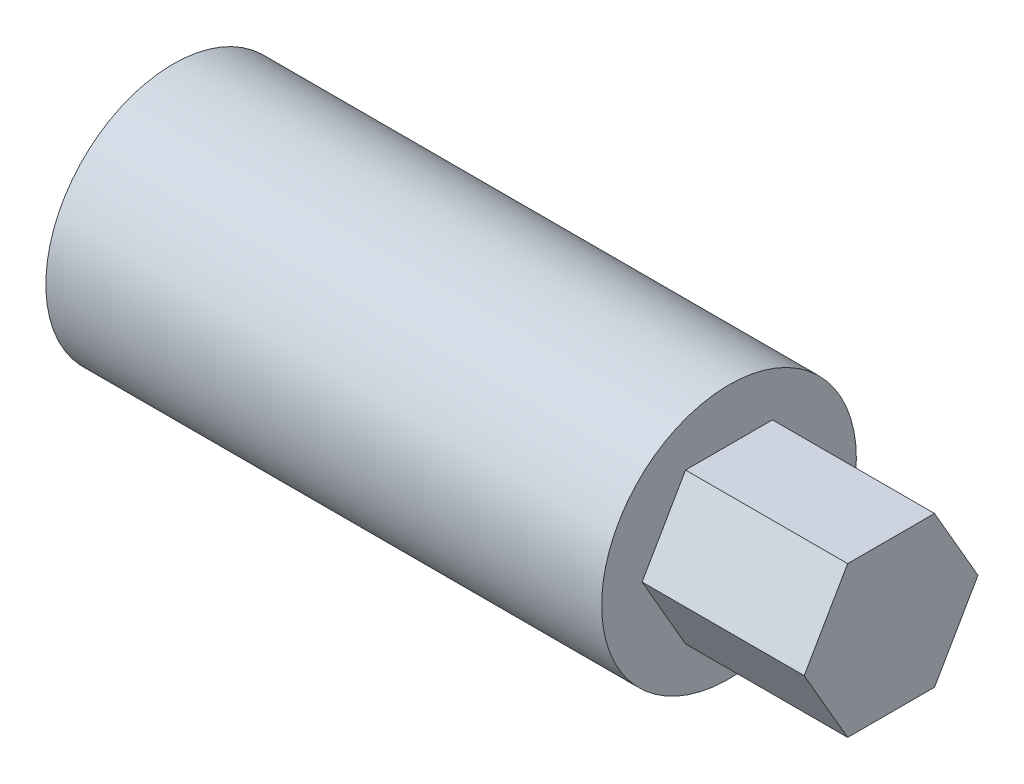
ISO-10303-21;
HEADER;
FILE_DESCRIPTION(('STEP AP214'),'2;1');
FILE_NAME('part.step','',(''),(''),'','','');
FILE_SCHEMA(('AUTOMOTIVE_DESIGN { 1 0 10303 214 1 1 1 1 }'));
ENDSEC;
DATA;
#1=APPLICATION_CONTEXT('core data for automotive mechanical design processes');
#2=APPLICATION_PROTOCOL_DEFINITION('international standard','automotive_design',2000,#1);
#3=PRODUCT_CONTEXT('',#1,'mechanical');
#4=PRODUCT('Part','Part','',(#3));
#5=PRODUCT_RELATED_PRODUCT_CATEGORY('part','',(#4));
#6=PRODUCT_DEFINITION_FORMATION('','',#4);
#7=PRODUCT_DEFINITION_CONTEXT('part definition',#1,'design');
#8=PRODUCT_DEFINITION('design','',#6,#7);
#9=PRODUCT_DEFINITION_SHAPE('','',#8);
#10=(LENGTH_UNIT() NAMED_UNIT(*) SI_UNIT(.MILLI.,.METRE.));
#11=(NAMED_UNIT(*) PLANE_ANGLE_UNIT() SI_UNIT($,.RADIAN.));
#12=(NAMED_UNIT(*) SI_UNIT($,.STERADIAN.) SOLID_ANGLE_UNIT());
#13=UNCERTAINTY_MEASURE_WITH_UNIT(LENGTH_MEASURE(1.E-05),#10,'distance_accuracy_value','');
#14=(GEOMETRIC_REPRESENTATION_CONTEXT(3) GLOBAL_UNCERTAINTY_ASSIGNED_CONTEXT((#13)) GLOBAL_UNIT_ASSIGNED_CONTEXT((#10,
#11,#12)) REPRESENTATION_CONTEXT('',''));
#15=CARTESIAN_POINT('',(0.,0.,0.));
#16=DIRECTION('',(0.,0.,1.));
#17=DIRECTION('',(1.,0.,0.));
#18=AXIS2_PLACEMENT_3D('',#15,#16,#17);
#19=CARTESIAN_POINT('',(62.,0.,0.));
#20=DIRECTION('',(-1.,0.,0.));
#21=DIRECTION('',(0.,0.,1.));
#22=AXIS2_PLACEMENT_3D('',#19,#20,#21);
#23=CYLINDRICAL_SURFACE('',#22,11.);
#24=CARTESIAN_POINT('',(0.,0.,0.));
#25=DIRECTION('',(1.,0.,0.));
#26=DIRECTION('',(0.,0.,-1.));
#27=AXIS2_PLACEMENT_3D('',#24,#25,#26);
#28=CIRCLE('',#27,11.);
#29=CARTESIAN_POINT('',(0.,0.,-11.));
#30=VERTEX_POINT('',#29);
#31=EDGE_CURVE('E11',#30,#30,#28,.T.);
#32=ORIENTED_EDGE('',*,*,#31,.T.);
#33=EDGE_LOOP('',(#32));
#34=FACE_BOUND('',#33,.T.);
#35=CARTESIAN_POINT('',(48.,0.,0.));
#36=DIRECTION('',(1.,0.,0.));
#37=DIRECTION('',(0.,0.,-1.));
#38=AXIS2_PLACEMENT_3D('',#35,#36,#37);
#39=CIRCLE('',#38,11.);
#40=CARTESIAN_POINT('',(48.,0.,-11.));
#41=VERTEX_POINT('',#40);
#42=EDGE_CURVE('E52',#41,#41,#39,.T.);
#43=ORIENTED_EDGE('',*,*,#42,.F.);
#44=EDGE_LOOP('',(#43));
#45=FACE_BOUND('',#44,.T.);
#46=ADVANCED_FACE('F44',(#34,#45),#23,.T.);
#47=CARTESIAN_POINT('',(0.,0.,0.));
#48=DIRECTION('',(1.,0.,0.));
#49=DIRECTION('',(0.,0.,-1.));
#50=AXIS2_PLACEMENT_3D('',#47,#48,#49);
#51=PLANE('',#50);
#52=ORIENTED_EDGE('',*,*,#31,.F.);
#53=EDGE_LOOP('',(#52));
#54=FACE_BOUND('',#53,.T.);
#55=ADVANCED_FACE('F171',(#54),#51,.F.);
#56=CARTESIAN_POINT('',(48.,0.,0.));
#57=DIRECTION('',(1.,0.,0.));
#58=DIRECTION('',(0.,0.,-1.));
#59=AXIS2_PLACEMENT_3D('',#56,#57,#58);
#60=PLANE('',#59);
#61=DIRECTION('',(0.,0.,1.));
#62=VECTOR('',#61,1.);
#63=CARTESIAN_POINT('',(48.,6.5,-3.75277674973257));
#64=LINE('',#63,#62);
#65=CARTESIAN_POINT('',(48.,6.5,-3.75277674973257));
#66=VERTEX_POINT('',#65);
#67=CARTESIAN_POINT('',(48.,6.5,3.75277674973257));
#68=VERTEX_POINT('',#67);
#69=EDGE_CURVE('E112',#66,#68,#64,.T.);
#70=ORIENTED_EDGE('',*,*,#69,.F.);
#71=DIRECTION('',(0.,0.866025403784439,0.5));
#72=VECTOR('',#71,1.);
#73=CARTESIAN_POINT('',(48.,0.,-7.50555349946514));
#74=LINE('',#73,#72);
#75=CARTESIAN_POINT('',(48.,0.,-7.50555349946514));
#76=VERTEX_POINT('',#75);
#77=EDGE_CURVE('E140',#76,#66,#74,.T.);
#78=ORIENTED_EDGE('',*,*,#77,.F.);
#79=DIRECTION('',(0.,0.866025403784438,-0.5));
#80=VECTOR('',#79,1.);
#81=CARTESIAN_POINT('',(48.,-6.5,-3.75277674973257));
#82=LINE('',#81,#80);
#83=CARTESIAN_POINT('',(48.,-6.5,-3.75277674973257));
#84=VERTEX_POINT('',#83);
#85=EDGE_CURVE('E134',#84,#76,#82,.T.);
#86=ORIENTED_EDGE('',*,*,#85,.F.);
#87=DIRECTION('',(0.,0.,-1.));
#88=VECTOR('',#87,1.);
#89=CARTESIAN_POINT('',(48.,-6.5,3.75277674973257));
#90=LINE('',#89,#88);
#91=CARTESIAN_POINT('',(48.,-6.5,3.75277674973257));
#92=VERTEX_POINT('',#91);
#93=EDGE_CURVE('E66',#92,#84,#90,.T.);
#94=ORIENTED_EDGE('',*,*,#93,.F.);
#95=DIRECTION('',(0.,-0.866025403784438,-0.5));
#96=VECTOR('',#95,1.);
#97=CARTESIAN_POINT('',(48.,0.,7.50555349946514));
#98=LINE('',#97,#96);
#99=CARTESIAN_POINT('',(48.,0.,7.50555349946514));
#100=VERTEX_POINT('',#99);
#101=EDGE_CURVE('E105',#100,#92,#98,.T.);
#102=ORIENTED_EDGE('',*,*,#101,.F.);
#103=DIRECTION('',(0.,-0.866025403784438,0.5));
#104=VECTOR('',#103,1.);
#105=CARTESIAN_POINT('',(48.,6.5,3.75277674973257));
#106=LINE('',#105,#104);
#107=EDGE_CURVE('E120',#68,#100,#106,.T.);
#108=ORIENTED_EDGE('',*,*,#107,.F.);
#109=EDGE_LOOP('',(#70,#78,#86,#94,#102,#108));
#110=FACE_BOUND('',#109,.T.);
#111=ORIENTED_EDGE('',*,*,#42,.T.);
#112=EDGE_LOOP('',(#111));
#113=FACE_BOUND('',#112,.T.);
#114=ADVANCED_FACE('F113',(#110,#113),#60,.T.);
#115=CARTESIAN_POINT('',(48.,6.5,3.75277674973257));
#116=DIRECTION('',(0.,0.5,0.866025403784438));
#117=DIRECTION('',(0.,-0.866025403784439,0.5));
#118=AXIS2_PLACEMENT_3D('',#115,#116,#117);
#119=PLANE('',#118);
#120=DIRECTION('',(0.,-0.866025403784438,0.5));
#121=VECTOR('',#120,1.);
#122=CARTESIAN_POINT('',(62.,6.5,3.75277674973257));
#123=LINE('',#122,#121);
#124=CARTESIAN_POINT('',(62.,6.5,3.75277674973257));
#125=VERTEX_POINT('',#124);
#126=CARTESIAN_POINT('',(62.,0.,7.50555349946514));
#127=VERTEX_POINT('',#126);
#128=EDGE_CURVE('E141',#125,#127,#123,.T.);
#129=ORIENTED_EDGE('',*,*,#128,.F.);
#130=DIRECTION('',(1.,0.,0.));
#131=VECTOR('',#130,1.);
#132=CARTESIAN_POINT('',(48.,6.5,3.75277674973257));
#133=LINE('',#132,#131);
#134=EDGE_CURVE('E125',#68,#125,#133,.T.);
#135=ORIENTED_EDGE('',*,*,#134,.F.);
#136=ORIENTED_EDGE('',*,*,#107,.T.);
#137=DIRECTION('',(1.,0.,0.));
#138=VECTOR('',#137,1.);
#139=CARTESIAN_POINT('',(48.,0.,7.50555349946514));
#140=LINE('',#139,#138);
#141=EDGE_CURVE('E99',#100,#127,#140,.T.);
#142=ORIENTED_EDGE('',*,*,#141,.T.);
#143=EDGE_LOOP('',(#129,#135,#136,#142));
#144=FACE_BOUND('',#143,.T.);
#145=ADVANCED_FACE('F123',(#144),#119,.T.);
#146=CARTESIAN_POINT('',(48.,6.5,-3.75277674973257));
#147=DIRECTION('',(0.,1.,0.));
#148=DIRECTION('',(0.,0.,1.));
#149=AXIS2_PLACEMENT_3D('',#146,#147,#148);
#150=PLANE('',#149);
#151=DIRECTION('',(0.,0.,1.));
#152=VECTOR('',#151,1.);
#153=CARTESIAN_POINT('',(62.,6.5,-3.75277674973257));
#154=LINE('',#153,#152);
#155=CARTESIAN_POINT('',(62.,6.5,-3.75277674973257));
#156=VERTEX_POINT('',#155);
#157=EDGE_CURVE('E122',#156,#125,#154,.T.);
#158=ORIENTED_EDGE('',*,*,#157,.F.);
#159=DIRECTION('',(1.,0.,0.));
#160=VECTOR('',#159,1.);
#161=CARTESIAN_POINT('',(48.,6.5,-3.75277674973257));
#162=LINE('',#161,#160);
#163=EDGE_CURVE('E157',#66,#156,#162,.T.);
#164=ORIENTED_EDGE('',*,*,#163,.F.);
#165=ORIENTED_EDGE('',*,*,#69,.T.);
#166=ORIENTED_EDGE('',*,*,#134,.T.);
#167=EDGE_LOOP('',(#158,#164,#165,#166));
#168=FACE_BOUND('',#167,.T.);
#169=ADVANCED_FACE('F195',(#168),#150,.T.);
#170=CARTESIAN_POINT('',(48.,0.,-7.50555349946514));
#171=DIRECTION('',(0.,0.5,-0.866025403784439));
#172=DIRECTION('',(0.,0.866025403784439,0.5));
#173=AXIS2_PLACEMENT_3D('',#170,#171,#172);
#174=PLANE('',#173);
#175=DIRECTION('',(0.,0.866025403784439,0.5));
#176=VECTOR('',#175,1.);
#177=CARTESIAN_POINT('',(62.,0.,-7.50555349946514));
#178=LINE('',#177,#176);
#179=CARTESIAN_POINT('',(62.,0.,-7.50555349946514));
#180=VERTEX_POINT('',#179);
#181=EDGE_CURVE('E126',#180,#156,#178,.T.);
#182=ORIENTED_EDGE('',*,*,#181,.F.);
#183=DIRECTION('',(1.,0.,0.));
#184=VECTOR('',#183,1.);
#185=CARTESIAN_POINT('',(48.,0.,-7.50555349946514));
#186=LINE('',#185,#184);
#187=EDGE_CURVE('E165',#76,#180,#186,.T.);
#188=ORIENTED_EDGE('',*,*,#187,.F.);
#189=ORIENTED_EDGE('',*,*,#77,.T.);
#190=ORIENTED_EDGE('',*,*,#163,.T.);
#191=EDGE_LOOP('',(#182,#188,#189,#190));
#192=FACE_BOUND('',#191,.T.);
#193=ADVANCED_FACE('F203',(#192),#174,.T.);
#194=CARTESIAN_POINT('',(48.,-6.5,-3.75277674973257));
#195=DIRECTION('',(0.,-0.5,-0.866025403784438));
#196=DIRECTION('',(0.,0.866025403784439,-0.5));
#197=AXIS2_PLACEMENT_3D('',#194,#195,#196);
#198=PLANE('',#197);
#199=DIRECTION('',(0.,0.866025403784438,-0.5));
#200=VECTOR('',#199,1.);
#201=CARTESIAN_POINT('',(62.,-6.5,-3.75277674973257));
#202=LINE('',#201,#200);
#203=CARTESIAN_POINT('',(62.,-6.5,-3.75277674973257));
#204=VERTEX_POINT('',#203);
#205=EDGE_CURVE('E147',#204,#180,#202,.T.);
#206=ORIENTED_EDGE('',*,*,#205,.F.);
#207=DIRECTION('',(1.,0.,0.));
#208=VECTOR('',#207,1.);
#209=CARTESIAN_POINT('',(48.,-6.5,-3.75277674973257));
#210=LINE('',#209,#208);
#211=EDGE_CURVE('E164',#84,#204,#210,.T.);
#212=ORIENTED_EDGE('',*,*,#211,.F.);
#213=ORIENTED_EDGE('',*,*,#85,.T.);
#214=ORIENTED_EDGE('',*,*,#187,.T.);
#215=EDGE_LOOP('',(#206,#212,#213,#214));
#216=FACE_BOUND('',#215,.T.);
#217=ADVANCED_FACE('F196',(#216),#198,.T.);
#218=CARTESIAN_POINT('',(48.,-6.5,3.75277674973257));
#219=DIRECTION('',(0.,-1.,0.));
#220=DIRECTION('',(0.,0.,-1.));
#221=AXIS2_PLACEMENT_3D('',#218,#219,#220);
#222=PLANE('',#221);
#223=DIRECTION('',(0.,0.,-1.));
#224=VECTOR('',#223,1.);
#225=CARTESIAN_POINT('',(62.,-6.5,3.75277674973257));
#226=LINE('',#225,#224);
#227=CARTESIAN_POINT('',(62.,-6.5,3.75277674973257));
#228=VERTEX_POINT('',#227);
#229=EDGE_CURVE('E58',#228,#204,#226,.T.);
#230=ORIENTED_EDGE('',*,*,#229,.F.);
#231=DIRECTION('',(1.,0.,0.));
#232=VECTOR('',#231,1.);
#233=CARTESIAN_POINT('',(48.,-6.5,3.75277674973257));
#234=LINE('',#233,#232);
#235=EDGE_CURVE('E109',#92,#228,#234,.T.);
#236=ORIENTED_EDGE('',*,*,#235,.F.);
#237=ORIENTED_EDGE('',*,*,#93,.T.);
#238=ORIENTED_EDGE('',*,*,#211,.T.);
#239=EDGE_LOOP('',(#230,#236,#237,#238));
#240=FACE_BOUND('',#239,.T.);
#241=ADVANCED_FACE('F194',(#240),#222,.T.);
#242=CARTESIAN_POINT('',(48.,0.,7.50555349946514));
#243=DIRECTION('',(0.,-0.5,0.866025403784438));
#244=DIRECTION('',(0.,-0.866025403784438,-0.5));
#245=AXIS2_PLACEMENT_3D('',#242,#243,#244);
#246=PLANE('',#245);
#247=DIRECTION('',(0.,-0.866025403784438,-0.5));
#248=VECTOR('',#247,1.);
#249=CARTESIAN_POINT('',(62.,0.,7.50555349946514));
#250=LINE('',#249,#248);
#251=EDGE_CURVE('E102',#127,#228,#250,.T.);
#252=ORIENTED_EDGE('',*,*,#251,.F.);
#253=ORIENTED_EDGE('',*,*,#141,.F.);
#254=ORIENTED_EDGE('',*,*,#101,.T.);
#255=ORIENTED_EDGE('',*,*,#235,.T.);
#256=EDGE_LOOP('',(#252,#253,#254,#255));
#257=FACE_BOUND('',#256,.T.);
#258=ADVANCED_FACE('F101',(#257),#246,.T.);
#259=CARTESIAN_POINT('',(62.,0.,0.));
#260=DIRECTION('',(1.,0.,0.));
#261=DIRECTION('',(0.,0.,-1.));
#262=AXIS2_PLACEMENT_3D('',#259,#260,#261);
#263=PLANE('',#262);
#264=ORIENTED_EDGE('',*,*,#157,.T.);
#265=ORIENTED_EDGE('',*,*,#128,.T.);
#266=ORIENTED_EDGE('',*,*,#251,.T.);
#267=ORIENTED_EDGE('',*,*,#229,.T.);
#268=ORIENTED_EDGE('',*,*,#205,.T.);
#269=ORIENTED_EDGE('',*,*,#181,.T.);
#270=EDGE_LOOP('',(#264,#265,#266,#267,#268,#269));
#271=FACE_BOUND('',#270,.T.);
#272=ADVANCED_FACE('F187',(#271),#263,.T.);
#273=CLOSED_SHELL('',(#46,#55,#114,#145,#169,#193,#217,#241,#258,#272));
#274=MANIFOLD_SOLID_BREP('B2',#273);
#275=ADVANCED_BREP_SHAPE_REPRESENTATION('',(#18,#274),#14);
#276=SHAPE_DEFINITION_REPRESENTATION(#9,#275);
ENDSEC;
END-ISO-10303-21;
